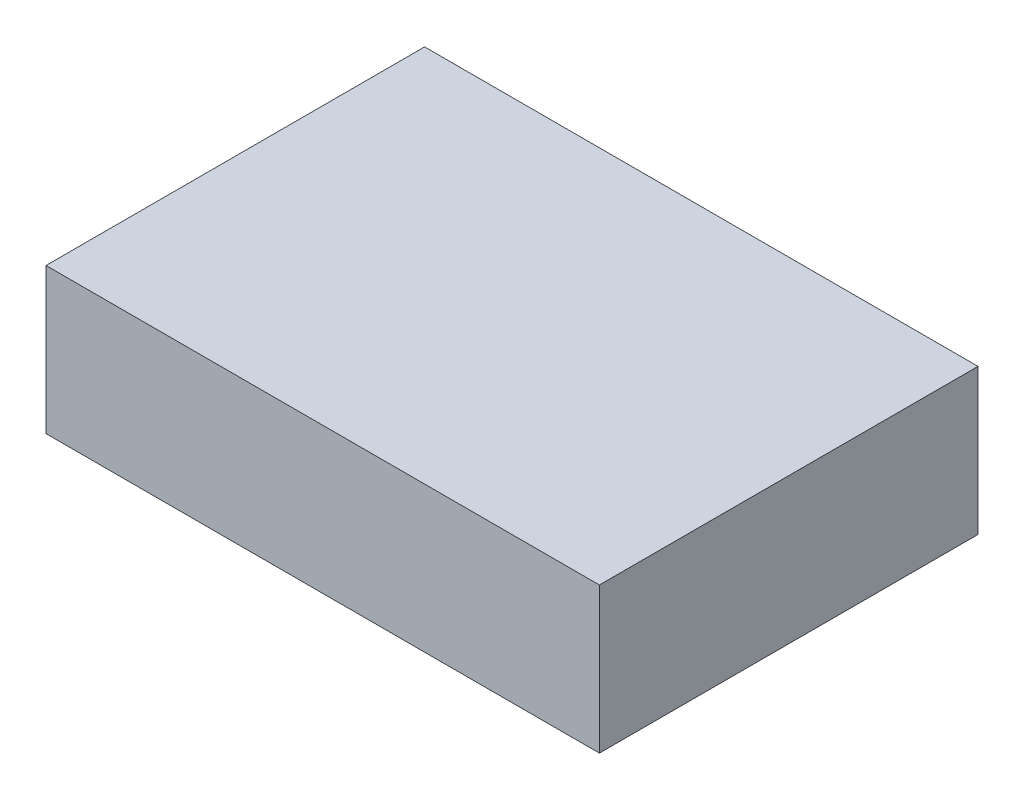
ISO-10303-21;
HEADER;
FILE_DESCRIPTION(('STEP AP214'),'2;1');
FILE_NAME('part.step','',(''),(''),'','','');
FILE_SCHEMA(('AUTOMOTIVE_DESIGN { 1 0 10303 214 1 1 1 1 }'));
ENDSEC;
DATA;
#1=APPLICATION_CONTEXT('core data for automotive mechanical design processes');
#2=APPLICATION_PROTOCOL_DEFINITION('international standard','automotive_design',2000,#1);
#3=PRODUCT_CONTEXT('',#1,'mechanical');
#4=PRODUCT('Part','Part','',(#3));
#5=PRODUCT_RELATED_PRODUCT_CATEGORY('part','',(#4));
#6=PRODUCT_DEFINITION_FORMATION('','',#4);
#7=PRODUCT_DEFINITION_CONTEXT('part definition',#1,'design');
#8=PRODUCT_DEFINITION('design','',#6,#7);
#9=PRODUCT_DEFINITION_SHAPE('','',#8);
#10=(LENGTH_UNIT() NAMED_UNIT(*) SI_UNIT(.MILLI.,.METRE.));
#11=(NAMED_UNIT(*) PLANE_ANGLE_UNIT() SI_UNIT($,.RADIAN.));
#12=(NAMED_UNIT(*) SI_UNIT($,.STERADIAN.) SOLID_ANGLE_UNIT());
#13=UNCERTAINTY_MEASURE_WITH_UNIT(LENGTH_MEASURE(1.E-05),#10,'distance_accuracy_value','');
#14=(GEOMETRIC_REPRESENTATION_CONTEXT(3) GLOBAL_UNCERTAINTY_ASSIGNED_CONTEXT((#13)) GLOBAL_UNIT_ASSIGNED_CONTEXT((#10,
#11,#12)) REPRESENTATION_CONTEXT('',''));
#15=CARTESIAN_POINT('',(0.,0.,0.));
#16=DIRECTION('',(0.,0.,1.));
#17=DIRECTION('',(1.,0.,0.));
#18=AXIS2_PLACEMENT_3D('',#15,#16,#17);
#19=CARTESIAN_POINT('',(30.1625,15.875,20.6375));
#20=DIRECTION('',(-1.,0.,0.));
#21=DIRECTION('',(0.,0.,1.));
#22=AXIS2_PLACEMENT_3D('',#19,#20,#21);
#23=PLANE('',#22);
#24=DIRECTION('',(0.,0.,-1.));
#25=VECTOR('',#24,1.);
#26=CARTESIAN_POINT('',(30.1625,0.,20.6375));
#27=LINE('',#26,#25);
#28=CARTESIAN_POINT('',(30.1625,0.,20.6375));
#29=VERTEX_POINT('',#28);
#30=CARTESIAN_POINT('',(30.1625,0.,-20.6375));
#31=VERTEX_POINT('',#30);
#32=EDGE_CURVE('E96',#29,#31,#27,.T.);
#33=ORIENTED_EDGE('',*,*,#32,.T.);
#34=DIRECTION('',(0.,-1.,0.));
#35=VECTOR('',#34,1.);
#36=CARTESIAN_POINT('',(30.1625,15.875,-20.6375));
#37=LINE('',#36,#35);
#38=CARTESIAN_POINT('',(30.1625,15.875,-20.6375));
#39=VERTEX_POINT('',#38);
#40=EDGE_CURVE('E11',#39,#31,#37,.T.);
#41=ORIENTED_EDGE('',*,*,#40,.F.);
#42=DIRECTION('',(0.,0.,-1.));
#43=VECTOR('',#42,1.);
#44=CARTESIAN_POINT('',(30.1625,15.875,20.6375));
#45=LINE('',#44,#43);
#46=CARTESIAN_POINT('',(30.1625,15.875,20.6375));
#47=VERTEX_POINT('',#46);
#48=EDGE_CURVE('E84',#47,#39,#45,.T.);
#49=ORIENTED_EDGE('',*,*,#48,.F.);
#50=DIRECTION('',(0.,-1.,0.));
#51=VECTOR('',#50,1.);
#52=CARTESIAN_POINT('',(30.1625,15.875,20.6375));
#53=LINE('',#52,#51);
#54=EDGE_CURVE('E92',#47,#29,#53,.T.);
#55=ORIENTED_EDGE('',*,*,#54,.T.);
#56=EDGE_LOOP('',(#33,#41,#49,#55));
#57=FACE_BOUND('',#56,.T.);
#58=ADVANCED_FACE('F33',(#57),#23,.F.);
#59=CARTESIAN_POINT('',(-30.1625,15.875,-20.6375));
#60=DIRECTION('',(0.,0.,1.));
#61=DIRECTION('',(1.,0.,0.));
#62=AXIS2_PLACEMENT_3D('',#59,#60,#61);
#63=PLANE('',#62);
#64=DIRECTION('',(-1.,0.,0.));
#65=VECTOR('',#64,1.);
#66=CARTESIAN_POINT('',(-30.1625,0.,-20.6375));
#67=LINE('',#66,#65);
#68=CARTESIAN_POINT('',(-30.1625,0.,-20.6375));
#69=VERTEX_POINT('',#68);
#70=EDGE_CURVE('E88',#31,#69,#67,.T.);
#71=ORIENTED_EDGE('',*,*,#70,.T.);
#72=DIRECTION('',(0.,-1.,0.));
#73=VECTOR('',#72,1.);
#74=CARTESIAN_POINT('',(-30.1625,15.875,-20.6375));
#75=LINE('',#74,#73);
#76=CARTESIAN_POINT('',(-30.1625,15.875,-20.6375));
#77=VERTEX_POINT('',#76);
#78=EDGE_CURVE('E41',#77,#69,#75,.T.);
#79=ORIENTED_EDGE('',*,*,#78,.F.);
#80=DIRECTION('',(-1.,0.,0.));
#81=VECTOR('',#80,1.);
#82=CARTESIAN_POINT('',(-30.1625,15.875,-20.6375));
#83=LINE('',#82,#81);
#84=EDGE_CURVE('E79',#39,#77,#83,.T.);
#85=ORIENTED_EDGE('',*,*,#84,.F.);
#86=ORIENTED_EDGE('',*,*,#40,.T.);
#87=EDGE_LOOP('',(#71,#79,#85,#86));
#88=FACE_BOUND('',#87,.T.);
#89=ADVANCED_FACE('F87',(#88),#63,.F.);
#90=CARTESIAN_POINT('',(-30.1625,15.875,20.6375));
#91=DIRECTION('',(1.,0.,0.));
#92=DIRECTION('',(0.,0.,-1.));
#93=AXIS2_PLACEMENT_3D('',#90,#91,#92);
#94=PLANE('',#93);
#95=DIRECTION('',(0.,0.,1.));
#96=VECTOR('',#95,1.);
#97=CARTESIAN_POINT('',(-30.1625,0.,20.6375));
#98=LINE('',#97,#96);
#99=CARTESIAN_POINT('',(-30.1625,0.,20.6375));
#100=VERTEX_POINT('',#99);
#101=EDGE_CURVE('E66',#69,#100,#98,.T.);
#102=ORIENTED_EDGE('',*,*,#101,.T.);
#103=DIRECTION('',(0.,-1.,0.));
#104=VECTOR('',#103,1.);
#105=CARTESIAN_POINT('',(-30.1625,15.875,20.6375));
#106=LINE('',#105,#104);
#107=CARTESIAN_POINT('',(-30.1625,15.875,20.6375));
#108=VERTEX_POINT('',#107);
#109=EDGE_CURVE('E89',#108,#100,#106,.T.);
#110=ORIENTED_EDGE('',*,*,#109,.F.);
#111=DIRECTION('',(0.,0.,1.));
#112=VECTOR('',#111,1.);
#113=CARTESIAN_POINT('',(-30.1625,15.875,20.6375));
#114=LINE('',#113,#112);
#115=EDGE_CURVE('E82',#77,#108,#114,.T.);
#116=ORIENTED_EDGE('',*,*,#115,.F.);
#117=ORIENTED_EDGE('',*,*,#78,.T.);
#118=EDGE_LOOP('',(#102,#110,#116,#117));
#119=FACE_BOUND('',#118,.T.);
#120=ADVANCED_FACE('F90',(#119),#94,.F.);
#121=CARTESIAN_POINT('',(-30.1625,15.875,20.6375));
#122=DIRECTION('',(0.,0.,-1.));
#123=DIRECTION('',(-1.,0.,0.));
#124=AXIS2_PLACEMENT_3D('',#121,#122,#123);
#125=PLANE('',#124);
#126=DIRECTION('',(1.,0.,0.));
#127=VECTOR('',#126,1.);
#128=CARTESIAN_POINT('',(-30.1625,0.,20.6375));
#129=LINE('',#128,#127);
#130=EDGE_CURVE('E72',#100,#29,#129,.T.);
#131=ORIENTED_EDGE('',*,*,#130,.T.);
#132=ORIENTED_EDGE('',*,*,#54,.F.);
#133=DIRECTION('',(1.,0.,0.));
#134=VECTOR('',#133,1.);
#135=CARTESIAN_POINT('',(-30.1625,15.875,20.6375));
#136=LINE('',#135,#134);
#137=EDGE_CURVE('E49',#108,#47,#136,.T.);
#138=ORIENTED_EDGE('',*,*,#137,.F.);
#139=ORIENTED_EDGE('',*,*,#109,.T.);
#140=EDGE_LOOP('',(#131,#132,#138,#139));
#141=FACE_BOUND('',#140,.T.);
#142=ADVANCED_FACE('F103',(#141),#125,.F.);
#143=CARTESIAN_POINT('',(0.,15.875,0.));
#144=DIRECTION('',(0.,-1.,0.));
#145=DIRECTION('',(0.,0.,-1.));
#146=AXIS2_PLACEMENT_3D('',#143,#144,#145);
#147=PLANE('',#146);
#148=ORIENTED_EDGE('',*,*,#48,.T.);
#149=ORIENTED_EDGE('',*,*,#84,.T.);
#150=ORIENTED_EDGE('',*,*,#115,.T.);
#151=ORIENTED_EDGE('',*,*,#137,.T.);
#152=EDGE_LOOP('',(#148,#149,#150,#151));
#153=FACE_BOUND('',#152,.T.);
#154=ADVANCED_FACE('F80',(#153),#147,.F.);
#155=CARTESIAN_POINT('',(0.,0.,0.));
#156=DIRECTION('',(0.,-1.,0.));
#157=DIRECTION('',(0.,0.,-1.));
#158=AXIS2_PLACEMENT_3D('',#155,#156,#157);
#159=PLANE('',#158);
#160=ORIENTED_EDGE('',*,*,#32,.F.);
#161=ORIENTED_EDGE('',*,*,#130,.F.);
#162=ORIENTED_EDGE('',*,*,#101,.F.);
#163=ORIENTED_EDGE('',*,*,#70,.F.);
#164=EDGE_LOOP('',(#160,#161,#162,#163));
#165=FACE_BOUND('',#164,.T.);
#166=ADVANCED_FACE('F106',(#165),#159,.T.);
#167=CLOSED_SHELL('',(#58,#89,#120,#142,#154,#166));
#168=MANIFOLD_SOLID_BREP('B2',#167);
#169=ADVANCED_BREP_SHAPE_REPRESENTATION('',(#18,#168),#14);
#170=SHAPE_DEFINITION_REPRESENTATION(#9,#169);
ENDSEC;
END-ISO-10303-21;
